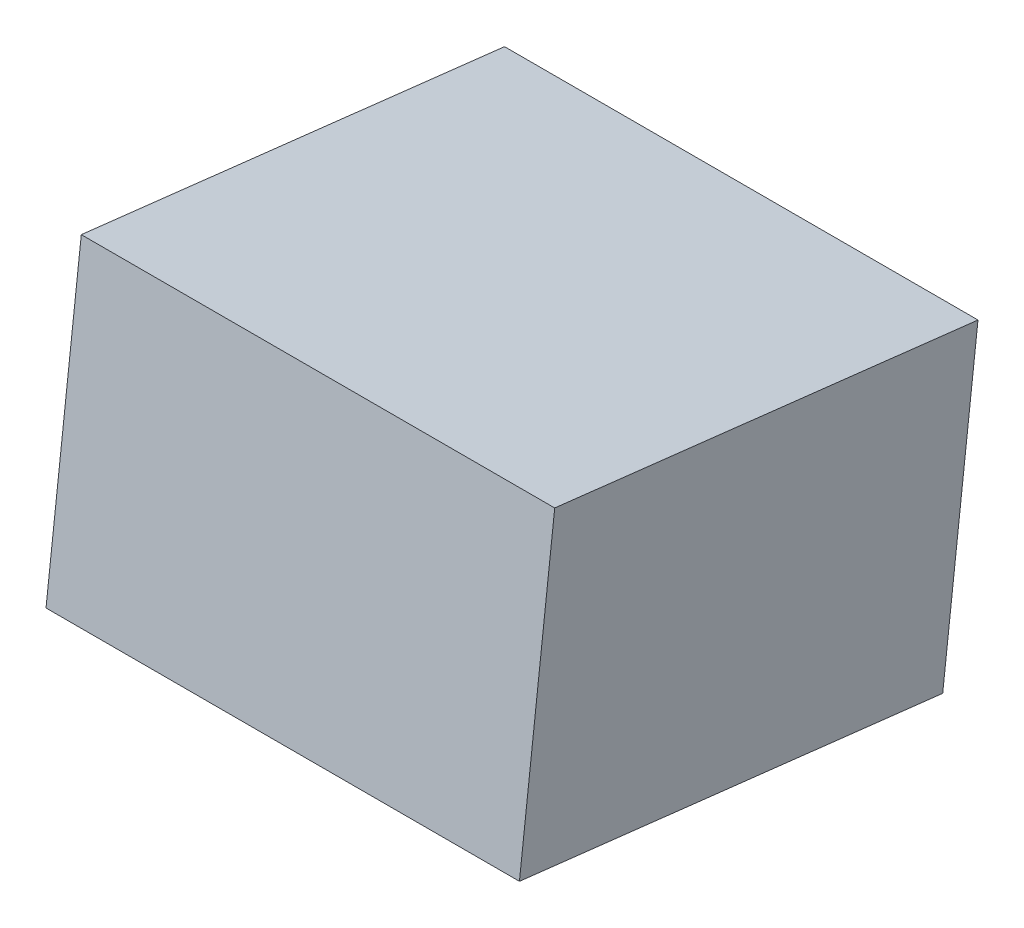
ISO-10303-21;
HEADER;
FILE_DESCRIPTION(('STEP AP214'),'2;1');
FILE_NAME('part.step','',(''),(''),'','','');
FILE_SCHEMA(('AUTOMOTIVE_DESIGN { 1 0 10303 214 1 1 1 1 }'));
ENDSEC;
DATA;
#1=APPLICATION_CONTEXT('core data for automotive mechanical design processes');
#2=APPLICATION_PROTOCOL_DEFINITION('international standard','automotive_design',2000,#1);
#3=PRODUCT_CONTEXT('',#1,'mechanical');
#4=PRODUCT('Part','Part','',(#3));
#5=PRODUCT_RELATED_PRODUCT_CATEGORY('part','',(#4));
#6=PRODUCT_DEFINITION_FORMATION('','',#4);
#7=PRODUCT_DEFINITION_CONTEXT('part definition',#1,'design');
#8=PRODUCT_DEFINITION('design','',#6,#7);
#9=PRODUCT_DEFINITION_SHAPE('','',#8);
#10=(LENGTH_UNIT() NAMED_UNIT(*) SI_UNIT(.MILLI.,.METRE.));
#11=(NAMED_UNIT(*) PLANE_ANGLE_UNIT() SI_UNIT($,.RADIAN.));
#12=(NAMED_UNIT(*) SI_UNIT($,.STERADIAN.) SOLID_ANGLE_UNIT());
#13=UNCERTAINTY_MEASURE_WITH_UNIT(LENGTH_MEASURE(1.E-05),#10,'distance_accuracy_value','');
#14=(GEOMETRIC_REPRESENTATION_CONTEXT(3) GLOBAL_UNCERTAINTY_ASSIGNED_CONTEXT((#13)) GLOBAL_UNIT_ASSIGNED_CONTEXT((#10,
#11,#12)) REPRESENTATION_CONTEXT('',''));
#15=CARTESIAN_POINT('',(0.,0.,0.));
#16=DIRECTION('',(0.,0.,1.));
#17=DIRECTION('',(1.,0.,0.));
#18=AXIS2_PLACEMENT_3D('',#15,#16,#17);
#19=CARTESIAN_POINT('',(-31.6730573404309,476.200269775773,-158.754836801428));
#20=DIRECTION('',(-1.,0.,0.));
#21=DIRECTION('',(0.,-1.,0.));
#22=AXIS2_PLACEMENT_3D('',#19,#20,#21);
#23=PLANE('',#22);
#24=DIRECTION('',(0.,-0.114660273656609,-0.993404762241953));
#25=VECTOR('',#24,1.);
#26=CARTESIAN_POINT('',(-31.67305734043,347.057650684319,-143.849001226069));
#27=LINE('',#26,#25);
#28=CARTESIAN_POINT('',(-31.67305734043,347.057650684319,-143.849001226069));
#29=VERTEX_POINT('',#28);
#30=CARTESIAN_POINT('',(-31.67305734043,326.41880142613,-322.66185842962));
#31=VERTEX_POINT('',#30);
#32=EDGE_CURVE('E100',#29,#31,#27,.T.);
#33=ORIENTED_EDGE('',*,*,#32,.T.);
#34=DIRECTION('',(0.,-0.993404762241953,0.114660273656608));
#35=VECTOR('',#34,1.);
#36=CARTESIAN_POINT('',(-31.6730573404309,455.561420517584,-337.567694004979));
#37=LINE('',#36,#35);
#38=CARTESIAN_POINT('',(-31.6730573404309,455.561420517584,-337.567694004979));
#39=VERTEX_POINT('',#38);
#40=EDGE_CURVE('E11',#39,#31,#37,.T.);
#41=ORIENTED_EDGE('',*,*,#40,.F.);
#42=DIRECTION('',(0.,-0.114660273656609,-0.993404762241953));
#43=VECTOR('',#42,1.);
#44=CARTESIAN_POINT('',(-31.6730573404309,476.200269775773,-158.754836801428));
#45=LINE('',#44,#43);
#46=CARTESIAN_POINT('',(-31.6730573404309,476.200269775773,-158.754836801428));
#47=VERTEX_POINT('',#46);
#48=EDGE_CURVE('E88',#47,#39,#45,.T.);
#49=ORIENTED_EDGE('',*,*,#48,.F.);
#50=DIRECTION('',(0.,-0.993404762241953,0.114660273656608));
#51=VECTOR('',#50,1.);
#52=CARTESIAN_POINT('',(-31.6730573404309,476.200269775773,-158.754836801428));
#53=LINE('',#52,#51);
#54=EDGE_CURVE('E96',#47,#29,#53,.T.);
#55=ORIENTED_EDGE('',*,*,#54,.T.);
#56=EDGE_LOOP('',(#33,#41,#49,#55));
#57=FACE_BOUND('',#56,.T.);
#58=ADVANCED_FACE('F37',(#57),#23,.F.);
#59=CARTESIAN_POINT('',(-231.673057340431,455.561420517583,-337.567694004979));
#60=DIRECTION('',(0.,0.114660273656608,0.993404762241953));
#61=DIRECTION('',(0.,-0.993404762241953,0.114660273656609));
#62=AXIS2_PLACEMENT_3D('',#59,#60,#61);
#63=PLANE('',#62);
#64=DIRECTION('',(-1.,0.,0.));
#65=VECTOR('',#64,1.);
#66=CARTESIAN_POINT('',(-231.67305734043,326.418801426129,-322.66185842962));
#67=LINE('',#66,#65);
#68=CARTESIAN_POINT('',(-231.67305734043,326.418801426129,-322.66185842962));
#69=VERTEX_POINT('',#68);
#70=EDGE_CURVE('E92',#31,#69,#67,.T.);
#71=ORIENTED_EDGE('',*,*,#70,.T.);
#72=DIRECTION('',(0.,-0.993404762241953,0.114660273656608));
#73=VECTOR('',#72,1.);
#74=CARTESIAN_POINT('',(-231.673057340431,455.561420517583,-337.567694004979));
#75=LINE('',#74,#73);
#76=CARTESIAN_POINT('',(-231.673057340431,455.561420517583,-337.567694004979));
#77=VERTEX_POINT('',#76);
#78=EDGE_CURVE('E45',#77,#69,#75,.T.);
#79=ORIENTED_EDGE('',*,*,#78,.F.);
#80=DIRECTION('',(-1.,0.,0.));
#81=VECTOR('',#80,1.);
#82=CARTESIAN_POINT('',(-231.673057340431,455.561420517583,-337.567694004979));
#83=LINE('',#82,#81);
#84=EDGE_CURVE('E83',#39,#77,#83,.T.);
#85=ORIENTED_EDGE('',*,*,#84,.F.);
#86=ORIENTED_EDGE('',*,*,#40,.T.);
#87=EDGE_LOOP('',(#71,#79,#85,#86));
#88=FACE_BOUND('',#87,.T.);
#89=ADVANCED_FACE('F91',(#88),#63,.F.);
#90=CARTESIAN_POINT('',(-231.673057340431,476.200269775772,-158.754836801428));
#91=DIRECTION('',(1.,0.,0.));
#92=DIRECTION('',(0.,1.,0.));
#93=AXIS2_PLACEMENT_3D('',#90,#91,#92);
#94=PLANE('',#93);
#95=DIRECTION('',(0.,0.114660273656609,0.993404762241953));
#96=VECTOR('',#95,1.);
#97=CARTESIAN_POINT('',(-231.67305734043,347.057650684318,-143.849001226068));
#98=LINE('',#97,#96);
#99=CARTESIAN_POINT('',(-231.67305734043,347.057650684318,-143.849001226068));
#100=VERTEX_POINT('',#99);
#101=EDGE_CURVE('E70',#69,#100,#98,.T.);
#102=ORIENTED_EDGE('',*,*,#101,.T.);
#103=DIRECTION('',(0.,-0.993404762241953,0.114660273656608));
#104=VECTOR('',#103,1.);
#105=CARTESIAN_POINT('',(-231.673057340431,476.200269775772,-158.754836801428));
#106=LINE('',#105,#104);
#107=CARTESIAN_POINT('',(-231.673057340431,476.200269775772,-158.754836801428));
#108=VERTEX_POINT('',#107);
#109=EDGE_CURVE('E93',#108,#100,#106,.T.);
#110=ORIENTED_EDGE('',*,*,#109,.F.);
#111=DIRECTION('',(0.,0.114660273656609,0.993404762241953));
#112=VECTOR('',#111,1.);
#113=CARTESIAN_POINT('',(-231.673057340431,476.200269775772,-158.754836801428));
#114=LINE('',#113,#112);
#115=EDGE_CURVE('E86',#77,#108,#114,.T.);
#116=ORIENTED_EDGE('',*,*,#115,.F.);
#117=ORIENTED_EDGE('',*,*,#78,.T.);
#118=EDGE_LOOP('',(#102,#110,#116,#117));
#119=FACE_BOUND('',#118,.T.);
#120=ADVANCED_FACE('F94',(#119),#94,.F.);
#121=CARTESIAN_POINT('',(-231.673057340431,476.200269775772,-158.754836801428));
#122=DIRECTION('',(0.,-0.114660273656608,-0.993404762241953));
#123=DIRECTION('',(0.,0.993404762241953,-0.114660273656609));
#124=AXIS2_PLACEMENT_3D('',#121,#122,#123);
#125=PLANE('',#124);
#126=DIRECTION('',(1.,0.,0.));
#127=VECTOR('',#126,1.);
#128=CARTESIAN_POINT('',(-231.67305734043,347.057650684318,-143.849001226068));
#129=LINE('',#128,#127);
#130=EDGE_CURVE('E76',#100,#29,#129,.T.);
#131=ORIENTED_EDGE('',*,*,#130,.T.);
#132=ORIENTED_EDGE('',*,*,#54,.F.);
#133=DIRECTION('',(1.,0.,0.));
#134=VECTOR('',#133,1.);
#135=CARTESIAN_POINT('',(-231.673057340431,476.200269775772,-158.754836801428));
#136=LINE('',#135,#134);
#137=EDGE_CURVE('E53',#108,#47,#136,.T.);
#138=ORIENTED_EDGE('',*,*,#137,.F.);
#139=ORIENTED_EDGE('',*,*,#109,.T.);
#140=EDGE_LOOP('',(#131,#132,#138,#139));
#141=FACE_BOUND('',#140,.T.);
#142=ADVANCED_FACE('F107',(#141),#125,.F.);
#143=CARTESIAN_POINT('',(-3.31397671047309E-12,488.022495892819,-56.3282914039654));
#144=DIRECTION('',(0.,-0.993404762241953,0.114660273656609));
#145=DIRECTION('',(0.,-0.114660273656609,-0.993404762241953));
#146=AXIS2_PLACEMENT_3D('',#143,#144,#145);
#147=PLANE('',#146);
#148=ORIENTED_EDGE('',*,*,#48,.T.);
#149=ORIENTED_EDGE('',*,*,#84,.T.);
#150=ORIENTED_EDGE('',*,*,#115,.T.);
#151=ORIENTED_EDGE('',*,*,#137,.T.);
#152=EDGE_LOOP('',(#148,#149,#150,#151));
#153=FACE_BOUND('',#152,.T.);
#154=ADVANCED_FACE('F84',(#153),#147,.F.);
#155=CARTESIAN_POINT('',(-2.42511133694517E-12,358.879876801365,-41.4224558286063));
#156=DIRECTION('',(0.,-0.993404762241953,0.114660273656609));
#157=DIRECTION('',(0.,-0.114660273656609,-0.993404762241953));
#158=AXIS2_PLACEMENT_3D('',#155,#156,#157);
#159=PLANE('',#158);
#160=ORIENTED_EDGE('',*,*,#32,.F.);
#161=ORIENTED_EDGE('',*,*,#130,.F.);
#162=ORIENTED_EDGE('',*,*,#101,.F.);
#163=ORIENTED_EDGE('',*,*,#70,.F.);
#164=EDGE_LOOP('',(#160,#161,#162,#163));
#165=FACE_BOUND('',#164,.T.);
#166=ADVANCED_FACE('F110',(#165),#159,.T.);
#167=CLOSED_SHELL('',(#58,#89,#120,#142,#154,#166));
#168=MANIFOLD_SOLID_BREP('B2',#167);
#169=ADVANCED_BREP_SHAPE_REPRESENTATION('',(#18,#168),#14);
#170=SHAPE_DEFINITION_REPRESENTATION(#9,#169);
ENDSEC;
END-ISO-10303-21;
